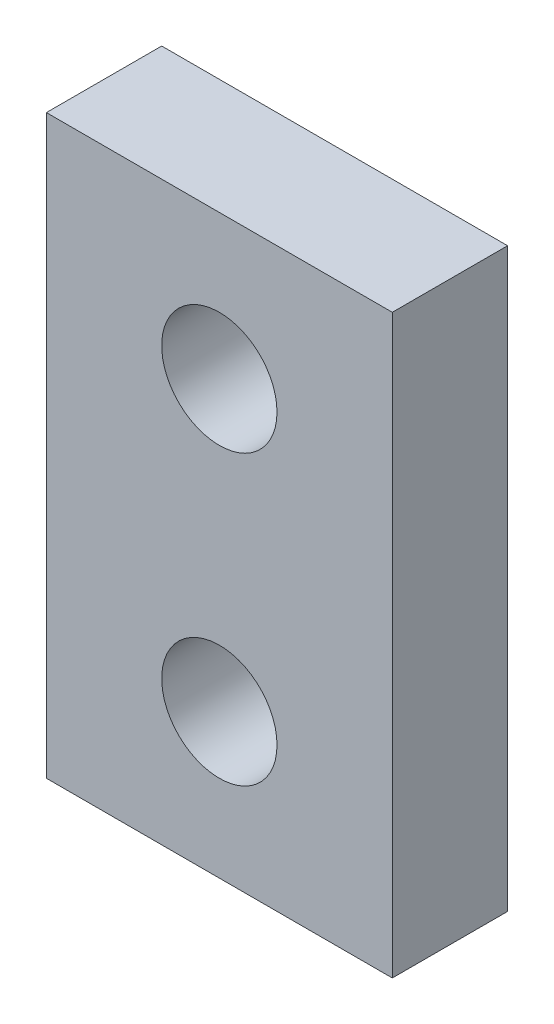
ISO-10303-21;
HEADER;
FILE_DESCRIPTION(('STEP AP214'),'2;1');
FILE_NAME('part.step','',(''),(''),'','','');
FILE_SCHEMA(('AUTOMOTIVE_DESIGN { 1 0 10303 214 1 1 1 1 }'));
ENDSEC;
DATA;
#1=APPLICATION_CONTEXT('core data for automotive mechanical design processes');
#2=APPLICATION_PROTOCOL_DEFINITION('international standard','automotive_design',2000,#1);
#3=PRODUCT_CONTEXT('',#1,'mechanical');
#4=PRODUCT('Part','Part','',(#3));
#5=PRODUCT_RELATED_PRODUCT_CATEGORY('part','',(#4));
#6=PRODUCT_DEFINITION_FORMATION('','',#4);
#7=PRODUCT_DEFINITION_CONTEXT('part definition',#1,'design');
#8=PRODUCT_DEFINITION('design','',#6,#7);
#9=PRODUCT_DEFINITION_SHAPE('','',#8);
#10=(LENGTH_UNIT() NAMED_UNIT(*) SI_UNIT(.MILLI.,.METRE.));
#11=(NAMED_UNIT(*) PLANE_ANGLE_UNIT() SI_UNIT($,.RADIAN.));
#12=(NAMED_UNIT(*) SI_UNIT($,.STERADIAN.) SOLID_ANGLE_UNIT());
#13=UNCERTAINTY_MEASURE_WITH_UNIT(LENGTH_MEASURE(1.E-05),#10,'distance_accuracy_value','');
#14=(GEOMETRIC_REPRESENTATION_CONTEXT(3) GLOBAL_UNCERTAINTY_ASSIGNED_CONTEXT((#13)) GLOBAL_UNIT_ASSIGNED_CONTEXT((#10,
#11,#12)) REPRESENTATION_CONTEXT('',''));
#15=CARTESIAN_POINT('',(0.,0.,0.));
#16=DIRECTION('',(0.,0.,1.));
#17=DIRECTION('',(1.,0.,0.));
#18=AXIS2_PLACEMENT_3D('',#15,#16,#17);
#19=CARTESIAN_POINT('',(0.,0.,10.));
#20=DIRECTION('',(0.,0.,-1.));
#21=DIRECTION('',(-1.,0.,0.));
#22=AXIS2_PLACEMENT_3D('',#19,#20,#21);
#23=PLANE('',#22);
#24=DIRECTION('',(0.,1.,0.));
#25=VECTOR('',#24,1.);
#26=CARTESIAN_POINT('',(15.,-25.,10.));
#27=LINE('',#26,#25);
#28=CARTESIAN_POINT('',(15.,-25.,10.));
#29=VERTEX_POINT('',#28);
#30=CARTESIAN_POINT('',(15.,25.,10.));
#31=VERTEX_POINT('',#30);
#32=EDGE_CURVE('E98',#29,#31,#27,.T.);
#33=ORIENTED_EDGE('',*,*,#32,.T.);
#34=DIRECTION('',(-1.,0.,0.));
#35=VECTOR('',#34,1.);
#36=CARTESIAN_POINT('',(-15.,25.,10.));
#37=LINE('',#36,#35);
#38=CARTESIAN_POINT('',(-15.,25.,10.));
#39=VERTEX_POINT('',#38);
#40=EDGE_CURVE('E93',#31,#39,#37,.T.);
#41=ORIENTED_EDGE('',*,*,#40,.T.);
#42=DIRECTION('',(0.,-1.,0.));
#43=VECTOR('',#42,1.);
#44=CARTESIAN_POINT('',(-15.,-25.,10.));
#45=LINE('',#44,#43);
#46=CARTESIAN_POINT('',(-15.,-25.,10.));
#47=VERTEX_POINT('',#46);
#48=EDGE_CURVE('E96',#39,#47,#45,.T.);
#49=ORIENTED_EDGE('',*,*,#48,.T.);
#50=DIRECTION('',(1.,0.,0.));
#51=VECTOR('',#50,1.);
#52=CARTESIAN_POINT('',(-15.,-25.,10.));
#53=LINE('',#52,#51);
#54=EDGE_CURVE('E63',#47,#29,#53,.T.);
#55=ORIENTED_EDGE('',*,*,#54,.T.);
#56=EDGE_LOOP('',(#33,#41,#49,#55));
#57=FACE_BOUND('',#56,.T.);
#58=CARTESIAN_POINT('',(0.,12.5,10.));
#59=DIRECTION('',(0.,0.,1.));
#60=DIRECTION('',(1.,0.,0.));
#61=AXIS2_PLACEMENT_3D('',#58,#59,#60);
#62=CIRCLE('',#61,5.);
#63=CARTESIAN_POINT('',(5.,12.5,10.));
#64=VERTEX_POINT('',#63);
#65=EDGE_CURVE('E118',#64,#64,#62,.T.);
#66=ORIENTED_EDGE('',*,*,#65,.F.);
#67=EDGE_LOOP('',(#66));
#68=FACE_BOUND('',#67,.T.);
#69=CARTESIAN_POINT('',(0.,-12.5,10.));
#70=DIRECTION('',(0.,0.,1.));
#71=DIRECTION('',(1.,0.,0.));
#72=AXIS2_PLACEMENT_3D('',#69,#70,#71);
#73=CIRCLE('',#72,5.);
#74=CARTESIAN_POINT('',(5.,-12.5,10.));
#75=VERTEX_POINT('',#74);
#76=EDGE_CURVE('E140',#75,#75,#73,.T.);
#77=ORIENTED_EDGE('',*,*,#76,.F.);
#78=EDGE_LOOP('',(#77));
#79=FACE_BOUND('',#78,.T.);
#80=ADVANCED_FACE('F45',(#57,#68,#79),#23,.F.);
#81=CARTESIAN_POINT('',(0.,0.,0.));
#82=DIRECTION('',(0.,0.,-1.));
#83=DIRECTION('',(-1.,0.,0.));
#84=AXIS2_PLACEMENT_3D('',#81,#82,#83);
#85=PLANE('',#84);
#86=CARTESIAN_POINT('',(0.,12.5,0.));
#87=DIRECTION('',(0.,0.,1.));
#88=DIRECTION('',(1.,0.,0.));
#89=AXIS2_PLACEMENT_3D('',#86,#87,#88);
#90=CIRCLE('',#89,5.);
#91=CARTESIAN_POINT('',(5.,12.5,0.));
#92=VERTEX_POINT('',#91);
#93=EDGE_CURVE('E136',#92,#92,#90,.T.);
#94=ORIENTED_EDGE('',*,*,#93,.T.);
#95=EDGE_LOOP('',(#94));
#96=FACE_BOUND('',#95,.T.);
#97=DIRECTION('',(0.,1.,0.));
#98=VECTOR('',#97,1.);
#99=CARTESIAN_POINT('',(15.,-25.,0.));
#100=LINE('',#99,#98);
#101=CARTESIAN_POINT('',(15.,-25.,0.));
#102=VERTEX_POINT('',#101);
#103=CARTESIAN_POINT('',(15.,25.,0.));
#104=VERTEX_POINT('',#103);
#105=EDGE_CURVE('E114',#102,#104,#100,.T.);
#106=ORIENTED_EDGE('',*,*,#105,.F.);
#107=DIRECTION('',(1.,0.,0.));
#108=VECTOR('',#107,1.);
#109=CARTESIAN_POINT('',(-15.,-25.,0.));
#110=LINE('',#109,#108);
#111=CARTESIAN_POINT('',(-15.,-25.,0.));
#112=VERTEX_POINT('',#111);
#113=EDGE_CURVE('E86',#112,#102,#110,.T.);
#114=ORIENTED_EDGE('',*,*,#113,.F.);
#115=DIRECTION('',(0.,-1.,0.));
#116=VECTOR('',#115,1.);
#117=CARTESIAN_POINT('',(-15.,-25.,0.));
#118=LINE('',#117,#116);
#119=CARTESIAN_POINT('',(-15.,25.,0.));
#120=VERTEX_POINT('',#119);
#121=EDGE_CURVE('E80',#120,#112,#118,.T.);
#122=ORIENTED_EDGE('',*,*,#121,.F.);
#123=DIRECTION('',(-1.,0.,0.));
#124=VECTOR('',#123,1.);
#125=CARTESIAN_POINT('',(-15.,25.,0.));
#126=LINE('',#125,#124);
#127=EDGE_CURVE('E103',#104,#120,#126,.T.);
#128=ORIENTED_EDGE('',*,*,#127,.F.);
#129=EDGE_LOOP('',(#106,#114,#122,#128));
#130=FACE_BOUND('',#129,.T.);
#131=CARTESIAN_POINT('',(0.,-12.5,0.));
#132=DIRECTION('',(0.,0.,1.));
#133=DIRECTION('',(1.,0.,0.));
#134=AXIS2_PLACEMENT_3D('',#131,#132,#133);
#135=CIRCLE('',#134,5.);
#136=CARTESIAN_POINT('',(5.,-12.5,0.));
#137=VERTEX_POINT('',#136);
#138=EDGE_CURVE('E144',#137,#137,#135,.T.);
#139=ORIENTED_EDGE('',*,*,#138,.T.);
#140=EDGE_LOOP('',(#139));
#141=FACE_BOUND('',#140,.T.);
#142=ADVANCED_FACE('F131',(#96,#130,#141),#85,.T.);
#143=CARTESIAN_POINT('',(15.,-25.,10.));
#144=DIRECTION('',(-1.,0.,0.));
#145=DIRECTION('',(0.,0.,1.));
#146=AXIS2_PLACEMENT_3D('',#143,#144,#145);
#147=PLANE('',#146);
#148=ORIENTED_EDGE('',*,*,#105,.T.);
#149=DIRECTION('',(0.,0.,-1.));
#150=VECTOR('',#149,1.);
#151=CARTESIAN_POINT('',(15.,25.,10.));
#152=LINE('',#151,#150);
#153=EDGE_CURVE('E11',#31,#104,#152,.T.);
#154=ORIENTED_EDGE('',*,*,#153,.F.);
#155=ORIENTED_EDGE('',*,*,#32,.F.);
#156=DIRECTION('',(0.,0.,-1.));
#157=VECTOR('',#156,1.);
#158=CARTESIAN_POINT('',(15.,-25.,10.));
#159=LINE('',#158,#157);
#160=EDGE_CURVE('E110',#29,#102,#159,.T.);
#161=ORIENTED_EDGE('',*,*,#160,.T.);
#162=EDGE_LOOP('',(#148,#154,#155,#161));
#163=FACE_BOUND('',#162,.T.);
#164=ADVANCED_FACE('F47',(#163),#147,.F.);
#165=CARTESIAN_POINT('',(-15.,25.,10.));
#166=DIRECTION('',(0.,-1.,0.));
#167=DIRECTION('',(0.,0.,-1.));
#168=AXIS2_PLACEMENT_3D('',#165,#166,#167);
#169=PLANE('',#168);
#170=ORIENTED_EDGE('',*,*,#127,.T.);
#171=DIRECTION('',(0.,0.,-1.));
#172=VECTOR('',#171,1.);
#173=CARTESIAN_POINT('',(-15.,25.,10.));
#174=LINE('',#173,#172);
#175=EDGE_CURVE('E55',#39,#120,#174,.T.);
#176=ORIENTED_EDGE('',*,*,#175,.F.);
#177=ORIENTED_EDGE('',*,*,#40,.F.);
#178=ORIENTED_EDGE('',*,*,#153,.T.);
#179=EDGE_LOOP('',(#170,#176,#177,#178));
#180=FACE_BOUND('',#179,.T.);
#181=ADVANCED_FACE('F102',(#180),#169,.F.);
#182=CARTESIAN_POINT('',(-15.,-25.,10.));
#183=DIRECTION('',(1.,0.,0.));
#184=DIRECTION('',(0.,0.,-1.));
#185=AXIS2_PLACEMENT_3D('',#182,#183,#184);
#186=PLANE('',#185);
#187=ORIENTED_EDGE('',*,*,#121,.T.);
#188=DIRECTION('',(0.,0.,-1.));
#189=VECTOR('',#188,1.);
#190=CARTESIAN_POINT('',(-15.,-25.,10.));
#191=LINE('',#190,#189);
#192=EDGE_CURVE('E105',#47,#112,#191,.T.);
#193=ORIENTED_EDGE('',*,*,#192,.F.);
#194=ORIENTED_EDGE('',*,*,#48,.F.);
#195=ORIENTED_EDGE('',*,*,#175,.T.);
#196=EDGE_LOOP('',(#187,#193,#194,#195));
#197=FACE_BOUND('',#196,.T.);
#198=ADVANCED_FACE('F106',(#197),#186,.F.);
#199=CARTESIAN_POINT('',(-15.,-25.,10.));
#200=DIRECTION('',(0.,1.,0.));
#201=DIRECTION('',(0.,0.,1.));
#202=AXIS2_PLACEMENT_3D('',#199,#200,#201);
#203=PLANE('',#202);
#204=ORIENTED_EDGE('',*,*,#113,.T.);
#205=ORIENTED_EDGE('',*,*,#160,.F.);
#206=ORIENTED_EDGE('',*,*,#54,.F.);
#207=ORIENTED_EDGE('',*,*,#192,.T.);
#208=EDGE_LOOP('',(#204,#205,#206,#207));
#209=FACE_BOUND('',#208,.T.);
#210=ADVANCED_FACE('F128',(#209),#203,.F.);
#211=CARTESIAN_POINT('',(0.,12.5,10.));
#212=DIRECTION('',(0.,0.,-1.));
#213=DIRECTION('',(-1.,0.,0.));
#214=AXIS2_PLACEMENT_3D('',#211,#212,#213);
#215=CYLINDRICAL_SURFACE('',#214,5.);
#216=ORIENTED_EDGE('',*,*,#65,.T.);
#217=EDGE_LOOP('',(#216));
#218=FACE_BOUND('',#217,.T.);
#219=ORIENTED_EDGE('',*,*,#93,.F.);
#220=EDGE_LOOP('',(#219));
#221=FACE_BOUND('',#220,.T.);
#222=ADVANCED_FACE('F163',(#218,#221),#215,.F.);
#223=CARTESIAN_POINT('',(0.,-12.5,10.));
#224=DIRECTION('',(0.,0.,-1.));
#225=DIRECTION('',(-1.,0.,0.));
#226=AXIS2_PLACEMENT_3D('',#223,#224,#225);
#227=CYLINDRICAL_SURFACE('',#226,5.);
#228=ORIENTED_EDGE('',*,*,#76,.T.);
#229=EDGE_LOOP('',(#228));
#230=FACE_BOUND('',#229,.T.);
#231=ORIENTED_EDGE('',*,*,#138,.F.);
#232=EDGE_LOOP('',(#231));
#233=FACE_BOUND('',#232,.T.);
#234=ADVANCED_FACE('F152',(#230,#233),#227,.F.);
#235=CLOSED_SHELL('',(#80,#142,#164,#181,#198,#210,#222,#234));
#236=MANIFOLD_SOLID_BREP('B2',#235);
#237=ADVANCED_BREP_SHAPE_REPRESENTATION('',(#18,#236),#14);
#238=SHAPE_DEFINITION_REPRESENTATION(#9,#237);
ENDSEC;
END-ISO-10303-21;
